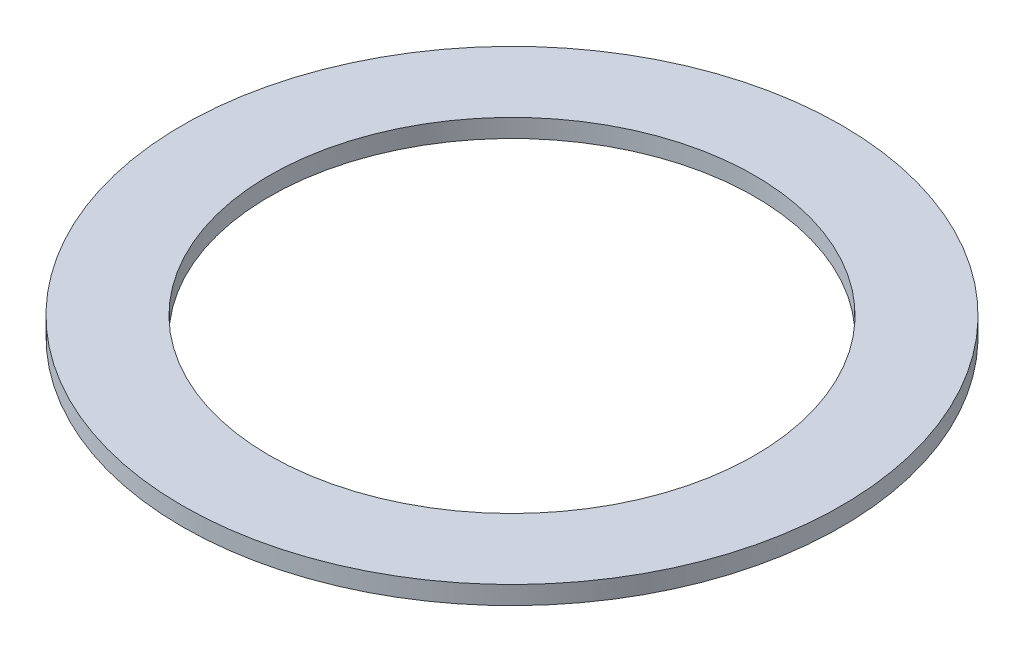
ISO-10303-21;
HEADER;
FILE_DESCRIPTION(('STEP AP214'),'2;1');
FILE_NAME('part.step','',(''),(''),'','','');
FILE_SCHEMA(('AUTOMOTIVE_DESIGN { 1 0 10303 214 1 1 1 1 }'));
ENDSEC;
DATA;
#1=APPLICATION_CONTEXT('core data for automotive mechanical design processes');
#2=APPLICATION_PROTOCOL_DEFINITION('international standard','automotive_design',2000,#1);
#3=PRODUCT_CONTEXT('',#1,'mechanical');
#4=PRODUCT('Part','Part','',(#3));
#5=PRODUCT_RELATED_PRODUCT_CATEGORY('part','',(#4));
#6=PRODUCT_DEFINITION_FORMATION('','',#4);
#7=PRODUCT_DEFINITION_CONTEXT('part definition',#1,'design');
#8=PRODUCT_DEFINITION('design','',#6,#7);
#9=PRODUCT_DEFINITION_SHAPE('','',#8);
#10=(LENGTH_UNIT() NAMED_UNIT(*) SI_UNIT(.MILLI.,.METRE.));
#11=(NAMED_UNIT(*) PLANE_ANGLE_UNIT() SI_UNIT($,.RADIAN.));
#12=(NAMED_UNIT(*) SI_UNIT($,.STERADIAN.) SOLID_ANGLE_UNIT());
#13=UNCERTAINTY_MEASURE_WITH_UNIT(LENGTH_MEASURE(1.E-05),#10,'distance_accuracy_value','');
#14=(GEOMETRIC_REPRESENTATION_CONTEXT(3) GLOBAL_UNCERTAINTY_ASSIGNED_CONTEXT((#13)) GLOBAL_UNIT_ASSIGNED_CONTEXT((#10,
#11,#12)) REPRESENTATION_CONTEXT('',''));
#15=CARTESIAN_POINT('',(0.,0.,0.));
#16=DIRECTION('',(0.,0.,1.));
#17=DIRECTION('',(1.,0.,0.));
#18=AXIS2_PLACEMENT_3D('',#15,#16,#17);
#19=CARTESIAN_POINT('',(0.,2.,0.));
#20=DIRECTION('',(0.,1.,0.));
#21=DIRECTION('',(0.,0.,1.));
#22=AXIS2_PLACEMENT_3D('',#19,#20,#21);
#23=PLANE('',#22);
#24=CARTESIAN_POINT('',(0.,2.,0.));
#25=DIRECTION('',(0.,1.,0.));
#26=DIRECTION('',(0.,0.,1.));
#27=AXIS2_PLACEMENT_3D('',#24,#25,#26);
#28=CIRCLE('',#27,36.);
#29=CARTESIAN_POINT('',(0.,2.,36.));
#30=VERTEX_POINT('',#29);
#31=EDGE_CURVE('E10',#30,#30,#28,.T.);
#32=ORIENTED_EDGE('',*,*,#31,.T.);
#33=EDGE_LOOP('',(#32));
#34=FACE_BOUND('',#33,.T.);
#35=CARTESIAN_POINT('',(0.,2.,0.));
#36=DIRECTION('',(0.,1.,0.));
#37=DIRECTION('',(0.,0.,1.));
#38=AXIS2_PLACEMENT_3D('',#35,#36,#37);
#39=CIRCLE('',#38,26.5);
#40=CARTESIAN_POINT('',(0.,2.,26.5));
#41=VERTEX_POINT('',#40);
#42=EDGE_CURVE('E45',#41,#41,#39,.T.);
#43=ORIENTED_EDGE('',*,*,#42,.F.);
#44=EDGE_LOOP('',(#43));
#45=FACE_BOUND('',#44,.T.);
#46=ADVANCED_FACE('F34',(#34,#45),#23,.T.);
#47=CARTESIAN_POINT('',(0.,0.,0.));
#48=DIRECTION('',(0.,1.,0.));
#49=DIRECTION('',(0.,0.,1.));
#50=AXIS2_PLACEMENT_3D('',#47,#48,#49);
#51=PLANE('',#50);
#52=CARTESIAN_POINT('',(0.,0.,0.));
#53=DIRECTION('',(0.,1.,0.));
#54=DIRECTION('',(0.,0.,1.));
#55=AXIS2_PLACEMENT_3D('',#52,#53,#54);
#56=CIRCLE('',#55,36.);
#57=CARTESIAN_POINT('',(0.,0.,36.));
#58=VERTEX_POINT('',#57);
#59=EDGE_CURVE('E38',#58,#58,#56,.T.);
#60=ORIENTED_EDGE('',*,*,#59,.F.);
#61=EDGE_LOOP('',(#60));
#62=FACE_BOUND('',#61,.T.);
#63=CARTESIAN_POINT('',(0.,0.,0.));
#64=DIRECTION('',(0.,1.,0.));
#65=DIRECTION('',(0.,0.,1.));
#66=AXIS2_PLACEMENT_3D('',#63,#64,#65);
#67=CIRCLE('',#66,26.5);
#68=CARTESIAN_POINT('',(0.,0.,26.5));
#69=VERTEX_POINT('',#68);
#70=EDGE_CURVE('E47',#69,#69,#67,.T.);
#71=ORIENTED_EDGE('',*,*,#70,.T.);
#72=EDGE_LOOP('',(#71));
#73=FACE_BOUND('',#72,.T.);
#74=ADVANCED_FACE('F57',(#62,#73),#51,.F.);
#75=CARTESIAN_POINT('',(0.,2.,0.));
#76=DIRECTION('',(0.,-1.,0.));
#77=DIRECTION('',(0.,0.,-1.));
#78=AXIS2_PLACEMENT_3D('',#75,#76,#77);
#79=CYLINDRICAL_SURFACE('',#78,36.);
#80=ORIENTED_EDGE('',*,*,#31,.F.);
#81=EDGE_LOOP('',(#80));
#82=FACE_BOUND('',#81,.T.);
#83=ORIENTED_EDGE('',*,*,#59,.T.);
#84=EDGE_LOOP('',(#83));
#85=FACE_BOUND('',#84,.T.);
#86=ADVANCED_FACE('F36',(#82,#85),#79,.T.);
#87=CARTESIAN_POINT('',(0.,2.,0.));
#88=DIRECTION('',(0.,-1.,0.));
#89=DIRECTION('',(0.,0.,-1.));
#90=AXIS2_PLACEMENT_3D('',#87,#88,#89);
#91=CYLINDRICAL_SURFACE('',#90,26.5);
#92=ORIENTED_EDGE('',*,*,#42,.T.);
#93=EDGE_LOOP('',(#92));
#94=FACE_BOUND('',#93,.T.);
#95=ORIENTED_EDGE('',*,*,#70,.F.);
#96=EDGE_LOOP('',(#95));
#97=FACE_BOUND('',#96,.T.);
#98=ADVANCED_FACE('F53',(#94,#97),#91,.F.);
#99=CLOSED_SHELL('',(#46,#74,#86,#98));
#100=MANIFOLD_SOLID_BREP('B2',#99);
#101=ADVANCED_BREP_SHAPE_REPRESENTATION('',(#18,#100),#14);
#102=SHAPE_DEFINITION_REPRESENTATION(#9,#101);
ENDSEC;
END-ISO-10303-21;
